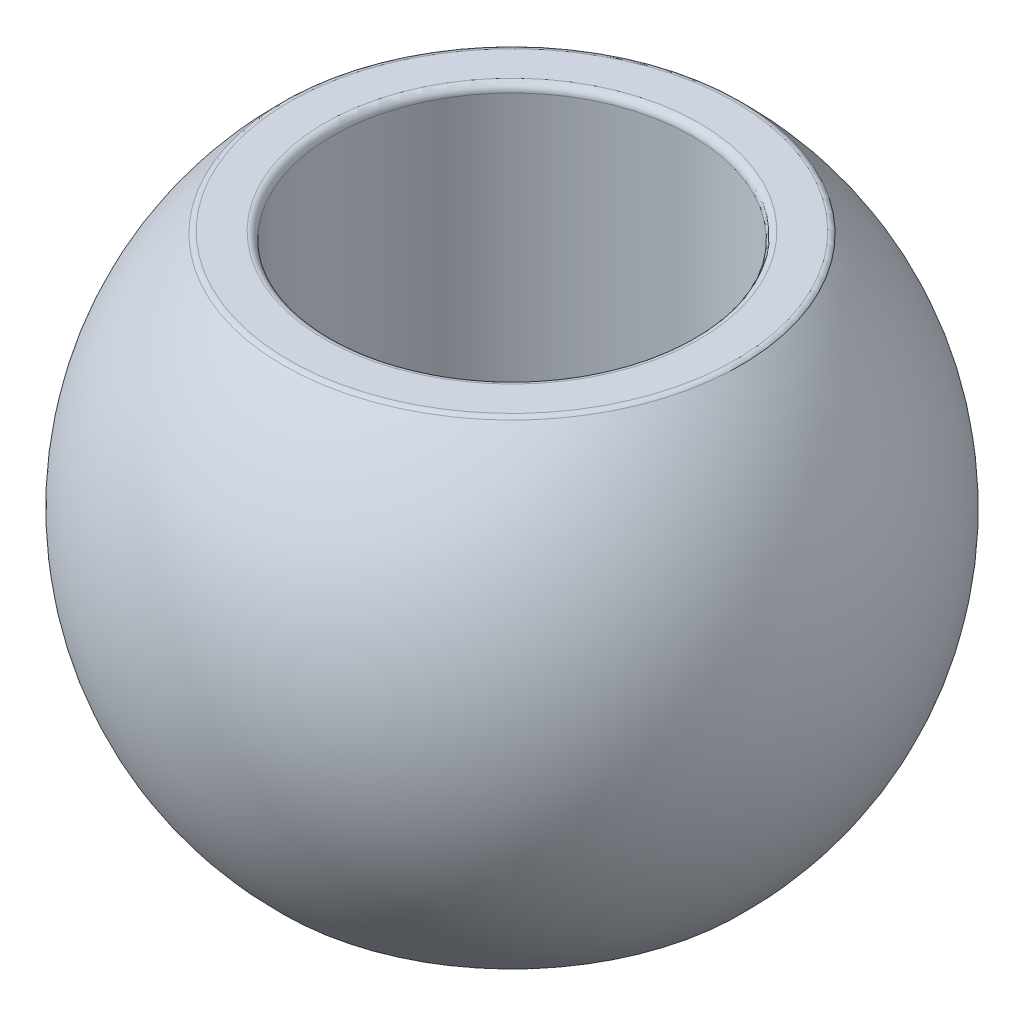
ISO-10303-21;
HEADER;
FILE_DESCRIPTION(('STEP AP214'),'2;1');
FILE_NAME('part.step','',(''),(''),'','','');
FILE_SCHEMA(('AUTOMOTIVE_DESIGN { 1 0 10303 214 1 1 1 1 }'));
ENDSEC;
DATA;
#1=APPLICATION_CONTEXT('core data for automotive mechanical design processes');
#2=APPLICATION_PROTOCOL_DEFINITION('international standard','automotive_design',2000,#1);
#3=PRODUCT_CONTEXT('',#1,'mechanical');
#4=PRODUCT('Part','Part','',(#3));
#5=PRODUCT_RELATED_PRODUCT_CATEGORY('part','',(#4));
#6=PRODUCT_DEFINITION_FORMATION('','',#4);
#7=PRODUCT_DEFINITION_CONTEXT('part definition',#1,'design');
#8=PRODUCT_DEFINITION('design','',#6,#7);
#9=PRODUCT_DEFINITION_SHAPE('','',#8);
#10=(LENGTH_UNIT() NAMED_UNIT(*) SI_UNIT(.MILLI.,.METRE.));
#11=(NAMED_UNIT(*) PLANE_ANGLE_UNIT() SI_UNIT($,.RADIAN.));
#12=(NAMED_UNIT(*) SI_UNIT($,.STERADIAN.) SOLID_ANGLE_UNIT());
#13=UNCERTAINTY_MEASURE_WITH_UNIT(LENGTH_MEASURE(1.E-05),#10,'distance_accuracy_value','');
#14=(GEOMETRIC_REPRESENTATION_CONTEXT(3) GLOBAL_UNCERTAINTY_ASSIGNED_CONTEXT((#13)) GLOBAL_UNIT_ASSIGNED_CONTEXT((#10,
#11,#12)) REPRESENTATION_CONTEXT('',''));
#15=CARTESIAN_POINT('',(0.,0.,0.));
#16=DIRECTION('',(0.,0.,1.));
#17=DIRECTION('',(1.,0.,0.));
#18=AXIS2_PLACEMENT_3D('',#15,#16,#17);
#19=CARTESIAN_POINT('',(0.,8.,0.));
#20=DIRECTION('',(0.,-1.,0.));
#21=DIRECTION('',(0.,0.,-1.));
#22=AXIS2_PLACEMENT_3D('',#19,#20,#21);
#23=PLANE('',#22);
#24=CARTESIAN_POINT('',(0.,8.,0.));
#25=DIRECTION('',(0.,-1.,0.));
#26=DIRECTION('',(0.,0.,-1.));
#27=AXIS2_PLACEMENT_3D('',#24,#25,#26);
#28=CIRCLE('',#27,7.44983221287567);
#29=CARTESIAN_POINT('',(0.,8.,-7.44983221287567));
#30=VERTEX_POINT('',#29);
#31=EDGE_CURVE('E54',#30,#30,#28,.F.);
#32=ORIENTED_EDGE('',*,*,#31,.T.);
#33=EDGE_LOOP('',(#32));
#34=FACE_BOUND('',#33,.T.);
#35=CARTESIAN_POINT('',(0.,8.,0.));
#36=DIRECTION('',(0.,-1.,0.));
#37=DIRECTION('',(0.,0.,-1.));
#38=AXIS2_PLACEMENT_3D('',#35,#36,#37);
#39=CIRCLE('',#38,6.25);
#40=CARTESIAN_POINT('',(0.,8.,-6.25));
#41=VERTEX_POINT('',#40);
#42=EDGE_CURVE('E59',#41,#41,#39,.T.);
#43=ORIENTED_EDGE('',*,*,#42,.T.);
#44=EDGE_LOOP('',(#43));
#45=FACE_BOUND('',#44,.T.);
#46=ADVANCED_FACE('F41',(#34,#45),#23,.F.);
#47=CARTESIAN_POINT('',(0.,0.,0.));
#48=DIRECTION('',(0.,1.,0.));
#49=DIRECTION('',(0.,0.,-1.));
#50=AXIS2_PLACEMENT_3D('',#47,#48,#49);
#51=SPHERICAL_SURFACE('',#50,11.);
#52=CARTESIAN_POINT('',(0.,-7.93023255813953,0.));
#53=DIRECTION('',(0.,1.,0.));
#54=DIRECTION('',(0.,0.,1.));
#55=AXIS2_PLACEMENT_3D('',#52,#53,#54);
#56=CIRCLE('',#55,7.62308412480301);
#57=CARTESIAN_POINT('',(0.,-7.93023255813953,-7.62308412480301));
#58=VERTEX_POINT('',#57);
#59=EDGE_CURVE('E73',#58,#58,#56,.T.);
#60=CARTESIAN_POINT('',(0.,7.93023255813953,0.));
#61=DIRECTION('',(0.,-1.,0.));
#62=DIRECTION('',(0.,0.,-1.));
#63=AXIS2_PLACEMENT_3D('',#60,#61,#62);
#64=CIRCLE('',#63,7.62308412480301);
#65=CARTESIAN_POINT('',(0.,7.93023255813953,-7.62308412480301));
#66=VERTEX_POINT('',#65);
#67=EDGE_CURVE('E77',#66,#66,#64,.T.);
#68=CARTESIAN_POINT('',(0.,-7.93023255813953,-7.62308412480301));
#69=CARTESIAN_POINT('',(0.,-7.80236716101044,-7.7561075440711));
#70=CARTESIAN_POINT('',(0.,-7.67114915701975,-7.88590769720583));
#71=CARTESIAN_POINT('',(0.,-7.40235284182454,-8.13874635493637));
#72=CARTESIAN_POINT('',(0.,-7.26477453062004,-8.26178485953218));
#73=CARTESIAN_POINT('',(0.,-6.9836025075066,-8.50078510391273));
#74=CARTESIAN_POINT('',(0.,-6.84000879559767,-8.61674684369746));
#75=CARTESIAN_POINT('',(0.,-6.54717042152934,-8.84130094546048));
#76=CARTESIAN_POINT('',(0.,-6.39792575936995,-8.94989330743876));
#77=CARTESIAN_POINT('',(0.,-6.09416308575483,-9.15943346871472));
#78=CARTESIAN_POINT('',(0.,-5.9396450742991,-9.26038126801238));
#79=CARTESIAN_POINT('',(0.,-5.62572696345227,-9.4543768022486));
#80=CARTESIAN_POINT('',(0.,-5.46632686406117,-9.54742453718715));
#81=CARTESIAN_POINT('',(0.,-5.14304811576543,-9.72538435351245));
#82=CARTESIAN_POINT('',(0.,-4.97916946686079,-9.8102964348992));
#83=CARTESIAN_POINT('',(0.,-4.64734851862144,-9.97176997574625));
#84=CARTESIAN_POINT('',(0.,-4.47940621928673,-10.0483314352065));
#85=CARTESIAN_POINT('',(0.,-4.13988315132462,-10.1929098989031));
#86=CARTESIAN_POINT('',(0.,-3.96830238269722,-10.2609269031393));
#87=CARTESIAN_POINT('',(0.,-3.62193677045902,-10.3882442569314));
#88=CARTESIAN_POINT('',(0.,-3.44715192684823,-10.4475446064873));
#89=CARTESIAN_POINT('',(0.,-3.09482067033618,-10.5572785191115));
#90=CARTESIAN_POINT('',(0.,-2.91727425743494,-10.6077120821799));
#91=CARTESIAN_POINT('',(0.,-2.55986935966188,-10.6995847383391));
#92=CARTESIAN_POINT('',(0.,-2.38001087479007,-10.7410238314299));
#93=CARTESIAN_POINT('',(0.,-2.01843718387728,-10.8148026355652));
#94=CARTESIAN_POINT('',(0.,-1.83672197783629,-10.8471423466096));
#95=CARTESIAN_POINT('',(0.,-1.47189489608757,-10.9026405116533));
#96=CARTESIAN_POINT('',(0.,-1.28878302037983,-10.9257989656526));
#97=CARTESIAN_POINT('',(0.,-0.921626186770326,-10.9628759859507));
#98=CARTESIAN_POINT('',(0.,-0.737581228868567,-10.9767945522496));
#99=CARTESIAN_POINT('',(0.,-0.369024180644539,-10.9953565592742));
#100=CARTESIAN_POINT('',(0.,-0.184512090322269,-11.));
#101=CARTESIAN_POINT('',(0.,0.184512090322271,-11.));
#102=CARTESIAN_POINT('',(0.,0.369024180644541,-10.9953565592742));
#103=CARTESIAN_POINT('',(0.,0.73758122886857,-10.9767945522496));
#104=CARTESIAN_POINT('',(0.,0.921626186770328,-10.9628759859507));
#105=CARTESIAN_POINT('',(0.,1.28878302037983,-10.9257989656526));
#106=CARTESIAN_POINT('',(0.,1.47189489608757,-10.9026405116533));
#107=CARTESIAN_POINT('',(0.,1.8367219778363,-10.8471423466096));
#108=CARTESIAN_POINT('',(0.,2.01843718387728,-10.8148026355652));
#109=CARTESIAN_POINT('',(0.,2.38001087479007,-10.7410238314299));
#110=CARTESIAN_POINT('',(0.,2.55986935966188,-10.6995847383391));
#111=CARTESIAN_POINT('',(0.,2.91727425743494,-10.6077120821799));
#112=CARTESIAN_POINT('',(0.,3.09482067033619,-10.5572785191115));
#113=CARTESIAN_POINT('',(0.,3.44715192684823,-10.4475446064873));
#114=CARTESIAN_POINT('',(0.,3.62193677045903,-10.3882442569314));
#115=CARTESIAN_POINT('',(0.,3.96830238269722,-10.2609269031393));
#116=CARTESIAN_POINT('',(0.,4.13988315132462,-10.1929098989031));
#117=CARTESIAN_POINT('',(0.,4.47940621928673,-10.0483314352065));
#118=CARTESIAN_POINT('',(0.,4.64734851862145,-9.97176997574625));
#119=CARTESIAN_POINT('',(0.,4.9791694668608,-9.8102964348992));
#120=CARTESIAN_POINT('',(0.,5.14304811576543,-9.72538435351245));
#121=CARTESIAN_POINT('',(0.,5.46632686406117,-9.54742453718714));
#122=CARTESIAN_POINT('',(0.,5.62572696345228,-9.4543768022486));
#123=CARTESIAN_POINT('',(0.,5.9396450742991,-9.26038126801238));
#124=CARTESIAN_POINT('',(0.,6.09416308575483,-9.15943346871471));
#125=CARTESIAN_POINT('',(0.,6.39792575936995,-8.94989330743876));
#126=CARTESIAN_POINT('',(0.,6.54717042152935,-8.84130094546048));
#127=CARTESIAN_POINT('',(0.,6.84000879559767,-8.61674684369746));
#128=CARTESIAN_POINT('',(0.,6.9836025075066,-8.50078510391273));
#129=CARTESIAN_POINT('',(0.,7.26477453062004,-8.26178485953218));
#130=CARTESIAN_POINT('',(0.,7.40235284182455,-8.13874635493636));
#131=CARTESIAN_POINT('',(0.,7.67114915701975,-7.88590769720582));
#132=CARTESIAN_POINT('',(0.,7.80236716101044,-7.7561075440711));
#133=CARTESIAN_POINT('',(0.,7.93023255813953,-7.62308412480301));
#134=B_SPLINE_CURVE_WITH_KNOTS('',3,(#68,#69,#70,#71,#72,#73,#74,#75,#76,#77,#78,#79,#80,#81,
#82,#83,#84,#85,#86,#87,#88,#89,#90,#91,#92,#93,#94,#95,#96,#97,#98,#99,#100,#101,#102,#103,
#104,#105,#106,#107,#108,#109,#110,#111,#112,#113,#114,#115,#116,#117,#118,#119,#120,#121,#122,
#123,#124,#125,#126,#127,#128,#129,#130,#131,#132,#133),.UNSPECIFIED.,.F.,.F.,(4,2,2,2,2,2,2,2,
2,2,2,2,2,2,2,2,2,2,2,2,2,2,2,2,2,2,2,2,2,2,2,2,4),(0.,0.553477888662464,1.10695577732493,
1.66043366598739,2.21391155464986,2.76738944331232,3.32086733197478,3.87434522063724,
4.42782310929971,4.98130099796217,5.53477888662464,6.0882567752871,6.64173466394956,
7.19521255261203,7.74869044127449,8.30216832993695,8.85564621859942,9.40912410726188,
9.96260199592435,10.5160798845868,11.0695577732493,11.6230356619117,12.1765135505742,
12.7299914392367,13.2834693278991,13.8369472165616,14.3904251052241,14.9439029938865,
15.497380882549,16.0508587712114,16.6043366598739,17.1578145485364,17.7112924371988),.UNSPECIFIED.);
#135=EDGE_CURVE('BSEAM82',#58,#66,#134,.T.);
#136=ORIENTED_EDGE('',*,*,#59,.T.);
#137=ORIENTED_EDGE('',*,*,#67,.T.);
#138=ORIENTED_EDGE('',*,*,#135,.T.);
#139=ORIENTED_EDGE('',*,*,#135,.F.);
#140=EDGE_LOOP('',(#136,#138,#137,#139));
#141=FACE_BOUND('',#140,.T.);
#142=ADVANCED_FACE('F82',(#141),#51,.T.);
#143=CARTESIAN_POINT('',(0.,-8.,0.));
#144=DIRECTION('',(0.,1.,0.));
#145=DIRECTION('',(0.,0.,1.));
#146=AXIS2_PLACEMENT_3D('',#143,#144,#145);
#147=PLANE('',#146);
#148=CARTESIAN_POINT('',(0.,-8.,0.));
#149=DIRECTION('',(0.,1.,0.));
#150=DIRECTION('',(0.,0.,1.));
#151=AXIS2_PLACEMENT_3D('',#148,#149,#150);
#152=CIRCLE('',#151,7.44983221287567);
#153=CARTESIAN_POINT('',(0.,-8.,7.44983221287567));
#154=VERTEX_POINT('',#153);
#155=EDGE_CURVE('E65',#154,#154,#152,.F.);
#156=ORIENTED_EDGE('',*,*,#155,.T.);
#157=EDGE_LOOP('',(#156));
#158=FACE_BOUND('',#157,.T.);
#159=CARTESIAN_POINT('',(0.,-8.,0.));
#160=DIRECTION('',(0.,1.,0.));
#161=DIRECTION('',(0.,0.,1.));
#162=AXIS2_PLACEMENT_3D('',#159,#160,#161);
#163=CIRCLE('',#162,6.25);
#164=CARTESIAN_POINT('',(0.,-8.,6.25));
#165=VERTEX_POINT('',#164);
#166=EDGE_CURVE('E69',#165,#165,#163,.T.);
#167=ORIENTED_EDGE('',*,*,#166,.T.);
#168=EDGE_LOOP('',(#167));
#169=FACE_BOUND('',#168,.T.);
#170=ADVANCED_FACE('F113',(#158,#169),#147,.F.);
#171=CARTESIAN_POINT('',(0.,-8.,0.));
#172=DIRECTION('',(0.,1.,0.));
#173=DIRECTION('',(0.,0.,1.));
#174=AXIS2_PLACEMENT_3D('',#171,#172,#173);
#175=CYLINDRICAL_SURFACE('',#174,6.);
#176=CARTESIAN_POINT('',(0.,-7.75,0.));
#177=DIRECTION('',(0.,1.,0.));
#178=DIRECTION('',(0.,0.,1.));
#179=AXIS2_PLACEMENT_3D('',#176,#177,#178);
#180=CIRCLE('',#179,6.);
#181=CARTESIAN_POINT('',(0.,-7.75,6.));
#182=VERTEX_POINT('',#181);
#183=EDGE_CURVE('E10',#182,#182,#180,.F.);
#184=ORIENTED_EDGE('',*,*,#183,.T.);
#185=EDGE_LOOP('',(#184));
#186=FACE_BOUND('',#185,.T.);
#187=CARTESIAN_POINT('',(0.,7.75,0.));
#188=DIRECTION('',(0.,-1.,0.));
#189=DIRECTION('',(0.,0.,-1.));
#190=AXIS2_PLACEMENT_3D('',#187,#188,#189);
#191=CIRCLE('',#190,6.);
#192=CARTESIAN_POINT('',(0.,7.75,-6.));
#193=VERTEX_POINT('',#192);
#194=EDGE_CURVE('E49',#193,#193,#191,.F.);
#195=ORIENTED_EDGE('',*,*,#194,.T.);
#196=EDGE_LOOP('',(#195));
#197=FACE_BOUND('',#196,.T.);
#198=ADVANCED_FACE('F108',(#186,#197),#175,.F.);
#199=CARTESIAN_POINT('',(0.,-7.75,0.));
#200=DIRECTION('',(0.,1.,0.));
#201=DIRECTION('',(0.,0.,1.));
#202=AXIS2_PLACEMENT_3D('',#199,#200,#201);
#203=TOROIDAL_SURFACE('',#202,7.44983221287567,0.25);
#204=ORIENTED_EDGE('',*,*,#155,.F.);
#205=EDGE_LOOP('',(#204));
#206=FACE_BOUND('',#205,.T.);
#207=ORIENTED_EDGE('',*,*,#59,.F.);
#208=EDGE_LOOP('',(#207));
#209=FACE_BOUND('',#208,.T.);
#210=ADVANCED_FACE('F88',(#206,#209),#203,.T.);
#211=CARTESIAN_POINT('',(0.,7.75,0.));
#212=DIRECTION('',(0.,-1.,0.));
#213=DIRECTION('',(0.,0.,-1.));
#214=AXIS2_PLACEMENT_3D('',#211,#212,#213);
#215=TOROIDAL_SURFACE('',#214,7.44983221287567,0.25);
#216=ORIENTED_EDGE('',*,*,#67,.F.);
#217=EDGE_LOOP('',(#216));
#218=FACE_BOUND('',#217,.T.);
#219=ORIENTED_EDGE('',*,*,#31,.F.);
#220=EDGE_LOOP('',(#219));
#221=FACE_BOUND('',#220,.T.);
#222=ADVANCED_FACE('F84',(#218,#221),#215,.T.);
#223=CARTESIAN_POINT('',(0.,-7.75,0.));
#224=DIRECTION('',(0.,1.,0.));
#225=DIRECTION('',(0.,0.,1.));
#226=AXIS2_PLACEMENT_3D('',#223,#224,#225);
#227=TOROIDAL_SURFACE('',#226,6.25,0.25);
#228=ORIENTED_EDGE('',*,*,#183,.F.);
#229=EDGE_LOOP('',(#228));
#230=FACE_BOUND('',#229,.T.);
#231=ORIENTED_EDGE('',*,*,#166,.F.);
#232=EDGE_LOOP('',(#231));
#233=FACE_BOUND('',#232,.T.);
#234=ADVANCED_FACE('F87',(#230,#233),#227,.T.);
#235=CARTESIAN_POINT('',(0.,7.75,0.));
#236=DIRECTION('',(0.,-1.,0.));
#237=DIRECTION('',(0.,0.,-1.));
#238=AXIS2_PLACEMENT_3D('',#235,#236,#237);
#239=TOROIDAL_SURFACE('',#238,6.25,0.25);
#240=ORIENTED_EDGE('',*,*,#42,.F.);
#241=EDGE_LOOP('',(#240));
#242=FACE_BOUND('',#241,.T.);
#243=ORIENTED_EDGE('',*,*,#194,.F.);
#244=EDGE_LOOP('',(#243));
#245=FACE_BOUND('',#244,.T.);
#246=ADVANCED_FACE('F43',(#242,#245),#239,.T.);
#247=CLOSED_SHELL('',(#46,#142,#170,#198,#210,#222,#234,#246));
#248=MANIFOLD_SOLID_BREP('B2',#247);
#249=ADVANCED_BREP_SHAPE_REPRESENTATION('',(#18,#248),#14);
#250=SHAPE_DEFINITION_REPRESENTATION(#9,#249);
ENDSEC;
END-ISO-10303-21;
